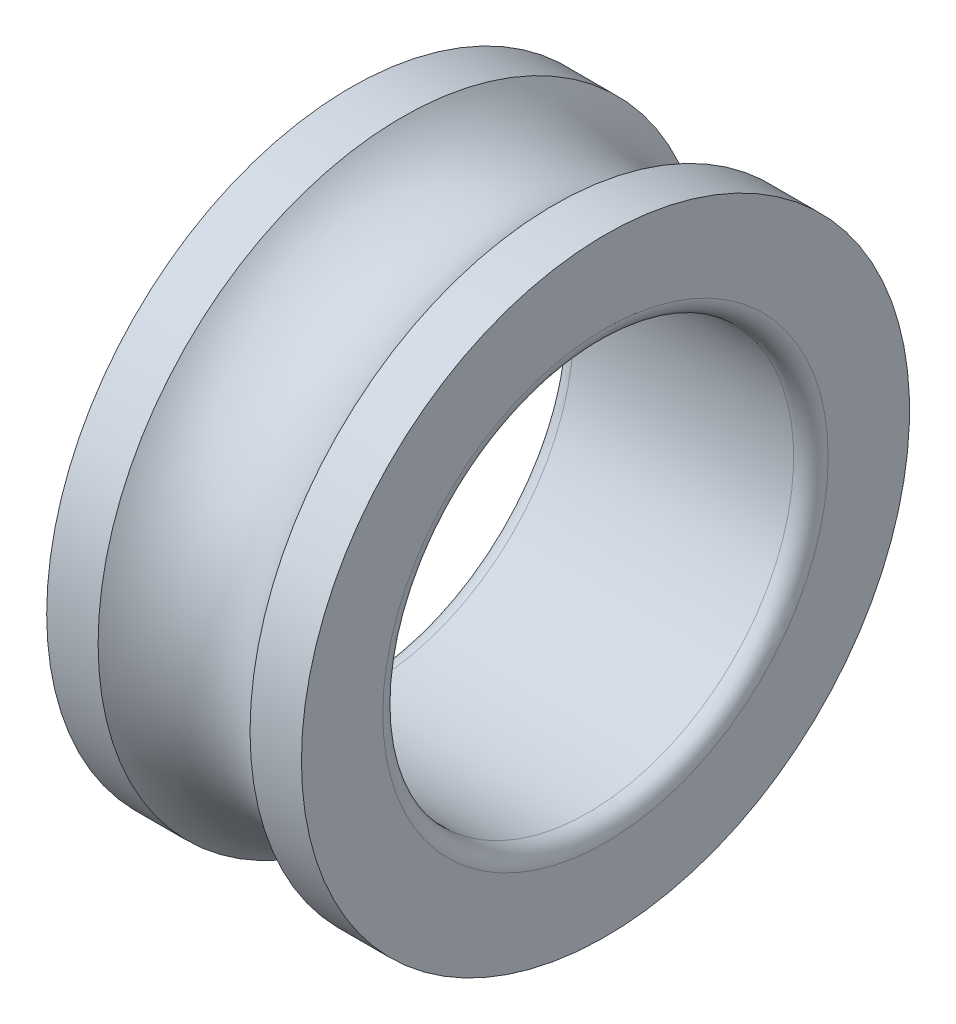
ISO-10303-21;
HEADER;
FILE_DESCRIPTION(('STEP AP214'),'2;1');
FILE_NAME('part.step','',(''),(''),'','','');
FILE_SCHEMA(('AUTOMOTIVE_DESIGN { 1 0 10303 214 1 1 1 1 }'));
ENDSEC;
DATA;
#1=APPLICATION_CONTEXT('core data for automotive mechanical design processes');
#2=APPLICATION_PROTOCOL_DEFINITION('international standard','automotive_design',2000,#1);
#3=PRODUCT_CONTEXT('',#1,'mechanical');
#4=PRODUCT('Part','Part','',(#3));
#5=PRODUCT_RELATED_PRODUCT_CATEGORY('part','',(#4));
#6=PRODUCT_DEFINITION_FORMATION('','',#4);
#7=PRODUCT_DEFINITION_CONTEXT('part definition',#1,'design');
#8=PRODUCT_DEFINITION('design','',#6,#7);
#9=PRODUCT_DEFINITION_SHAPE('','',#8);
#10=(LENGTH_UNIT() NAMED_UNIT(*) SI_UNIT(.MILLI.,.METRE.));
#11=(NAMED_UNIT(*) PLANE_ANGLE_UNIT() SI_UNIT($,.RADIAN.));
#12=(NAMED_UNIT(*) SI_UNIT($,.STERADIAN.) SOLID_ANGLE_UNIT());
#13=UNCERTAINTY_MEASURE_WITH_UNIT(LENGTH_MEASURE(1.E-05),#10,'distance_accuracy_value','');
#14=(GEOMETRIC_REPRESENTATION_CONTEXT(3) GLOBAL_UNCERTAINTY_ASSIGNED_CONTEXT((#13)) GLOBAL_UNIT_ASSIGNED_CONTEXT((#10,
#11,#12)) REPRESENTATION_CONTEXT('',''));
#15=CARTESIAN_POINT('',(0.,0.,0.));
#16=DIRECTION('',(0.,0.,1.));
#17=DIRECTION('',(1.,0.,0.));
#18=AXIS2_PLACEMENT_3D('',#15,#16,#17);
#19=CARTESIAN_POINT('',(-15.5,37.,0.));
#20=DIRECTION('',(1.,0.,0.));
#21=DIRECTION('',(0.,0.,-1.));
#22=AXIS2_PLACEMENT_3D('',#19,#20,#21);
#23=PLANE('',#22);
#24=CARTESIAN_POINT('',(-15.5,0.,0.));
#25=DIRECTION('',(-1.,0.,0.));
#26=DIRECTION('',(0.,0.,1.));
#27=AXIS2_PLACEMENT_3D('',#24,#25,#26);
#28=CIRCLE('',#27,27.1);
#29=CARTESIAN_POINT('',(-15.5,0.,27.1));
#30=VERTEX_POINT('',#29);
#31=EDGE_CURVE('E10',#30,#30,#28,.T.);
#32=ORIENTED_EDGE('',*,*,#31,.F.);
#33=EDGE_LOOP('',(#32));
#34=FACE_BOUND('',#33,.T.);
#35=CARTESIAN_POINT('',(-15.5,0.,0.));
#36=DIRECTION('',(-1.,0.,0.));
#37=DIRECTION('',(0.,0.,1.));
#38=AXIS2_PLACEMENT_3D('',#35,#36,#37);
#39=CIRCLE('',#38,37.);
#40=CARTESIAN_POINT('',(-15.5,0.,37.));
#41=VERTEX_POINT('',#40);
#42=EDGE_CURVE('E64',#41,#41,#39,.T.);
#43=ORIENTED_EDGE('',*,*,#42,.T.);
#44=EDGE_LOOP('',(#43));
#45=FACE_BOUND('',#44,.T.);
#46=ADVANCED_FACE('F36',(#34,#45),#23,.F.);
#47=CARTESIAN_POINT('',(-13.4,0.,0.));
#48=DIRECTION('',(-1.,0.,0.));
#49=DIRECTION('',(0.,0.,1.));
#50=AXIS2_PLACEMENT_3D('',#47,#48,#49);
#51=TOROIDAL_SURFACE('',#50,27.1,2.1);
#52=CARTESIAN_POINT('',(-13.4,0.,0.));
#53=DIRECTION('',(-1.,0.,0.));
#54=DIRECTION('',(0.,0.,1.));
#55=AXIS2_PLACEMENT_3D('',#52,#53,#54);
#56=CIRCLE('',#55,25.);
#57=CARTESIAN_POINT('',(-13.4,0.,25.));
#58=VERTEX_POINT('',#57);
#59=EDGE_CURVE('E42',#58,#58,#56,.T.);
#60=ORIENTED_EDGE('',*,*,#59,.F.);
#61=EDGE_LOOP('',(#60));
#62=FACE_BOUND('',#61,.T.);
#63=ORIENTED_EDGE('',*,*,#31,.T.);
#64=EDGE_LOOP('',(#63));
#65=FACE_BOUND('',#64,.T.);
#66=ADVANCED_FACE('F101',(#62,#65),#51,.T.);
#67=CARTESIAN_POINT('',(-24.761443411834,0.,0.));
#68=DIRECTION('',(-1.,0.,0.));
#69=DIRECTION('',(0.,0.,1.));
#70=AXIS2_PLACEMENT_3D('',#67,#68,#69);
#71=CYLINDRICAL_SURFACE('',#70,25.);
#72=CARTESIAN_POINT('',(13.4,0.,0.));
#73=DIRECTION('',(-1.,0.,0.));
#74=DIRECTION('',(0.,0.,1.));
#75=AXIS2_PLACEMENT_3D('',#72,#73,#74);
#76=CIRCLE('',#75,25.);
#77=CARTESIAN_POINT('',(13.4,0.,25.));
#78=VERTEX_POINT('',#77);
#79=EDGE_CURVE('E46',#78,#78,#76,.T.);
#80=ORIENTED_EDGE('',*,*,#79,.F.);
#81=EDGE_LOOP('',(#80));
#82=FACE_BOUND('',#81,.T.);
#83=ORIENTED_EDGE('',*,*,#59,.T.);
#84=EDGE_LOOP('',(#83));
#85=FACE_BOUND('',#84,.T.);
#86=ADVANCED_FACE('F96',(#82,#85),#71,.F.);
#87=CARTESIAN_POINT('',(13.4,0.,0.));
#88=DIRECTION('',(-1.,0.,0.));
#89=DIRECTION('',(0.,0.,1.));
#90=AXIS2_PLACEMENT_3D('',#87,#88,#89);
#91=TOROIDAL_SURFACE('',#90,27.1,2.1);
#92=CARTESIAN_POINT('',(15.5,0.,0.));
#93=DIRECTION('',(-1.,0.,0.));
#94=DIRECTION('',(0.,0.,1.));
#95=AXIS2_PLACEMENT_3D('',#92,#93,#94);
#96=CIRCLE('',#95,27.1);
#97=CARTESIAN_POINT('',(15.5,0.,27.1));
#98=VERTEX_POINT('',#97);
#99=EDGE_CURVE('E50',#98,#98,#96,.T.);
#100=ORIENTED_EDGE('',*,*,#99,.F.);
#101=EDGE_LOOP('',(#100));
#102=FACE_BOUND('',#101,.T.);
#103=ORIENTED_EDGE('',*,*,#79,.T.);
#104=EDGE_LOOP('',(#103));
#105=FACE_BOUND('',#104,.T.);
#106=ADVANCED_FACE('F90',(#102,#105),#91,.T.);
#107=CARTESIAN_POINT('',(15.5,37.,0.));
#108=DIRECTION('',(-1.,0.,0.));
#109=DIRECTION('',(0.,0.,1.));
#110=AXIS2_PLACEMENT_3D('',#107,#108,#109);
#111=PLANE('',#110);
#112=CARTESIAN_POINT('',(15.5,0.,0.));
#113=DIRECTION('',(-1.,0.,0.));
#114=DIRECTION('',(0.,0.,1.));
#115=AXIS2_PLACEMENT_3D('',#112,#113,#114);
#116=CIRCLE('',#115,37.);
#117=CARTESIAN_POINT('',(15.5,0.,37.));
#118=VERTEX_POINT('',#117);
#119=EDGE_CURVE('E55',#118,#118,#116,.T.);
#120=ORIENTED_EDGE('',*,*,#119,.F.);
#121=EDGE_LOOP('',(#120));
#122=FACE_BOUND('',#121,.T.);
#123=ORIENTED_EDGE('',*,*,#99,.T.);
#124=EDGE_LOOP('',(#123));
#125=FACE_BOUND('',#124,.T.);
#126=ADVANCED_FACE('F84',(#122,#125),#111,.F.);
#127=CARTESIAN_POINT('',(-24.761443411834,0.,0.));
#128=DIRECTION('',(-1.,0.,0.));
#129=DIRECTION('',(0.,0.,1.));
#130=AXIS2_PLACEMENT_3D('',#127,#128,#129);
#131=CYLINDRICAL_SURFACE('',#130,37.);
#132=CARTESIAN_POINT('',(9.24426332027484,0.,0.));
#133=DIRECTION('',(-1.,0.,0.));
#134=DIRECTION('',(0.,0.,1.));
#135=AXIS2_PLACEMENT_3D('',#132,#133,#134);
#136=CIRCLE('',#135,37.);
#137=CARTESIAN_POINT('',(9.24426332027484,0.,37.));
#138=VERTEX_POINT('',#137);
#139=EDGE_CURVE('E58',#138,#138,#136,.T.);
#140=ORIENTED_EDGE('',*,*,#139,.F.);
#141=EDGE_LOOP('',(#140));
#142=FACE_BOUND('',#141,.T.);
#143=ORIENTED_EDGE('',*,*,#119,.T.);
#144=EDGE_LOOP('',(#143));
#145=FACE_BOUND('',#144,.T.);
#146=ADVANCED_FACE('F78',(#142,#145),#131,.T.);
#147=CARTESIAN_POINT('',(0.,0.,0.));
#148=DIRECTION('',(-1.,0.,0.));
#149=DIRECTION('',(0.,0.,1.));
#150=AXIS2_PLACEMENT_3D('',#147,#148,#149);
#151=TOROIDAL_SURFACE('',#150,44.6513786774294,12.);
#152=CARTESIAN_POINT('',(-9.24426332027484,0.,0.));
#153=DIRECTION('',(-1.,0.,0.));
#154=DIRECTION('',(0.,0.,1.));
#155=AXIS2_PLACEMENT_3D('',#152,#153,#154);
#156=CIRCLE('',#155,37.);
#157=CARTESIAN_POINT('',(-9.24426332027484,0.,37.));
#158=VERTEX_POINT('',#157);
#159=EDGE_CURVE('E61',#158,#158,#156,.T.);
#160=ORIENTED_EDGE('',*,*,#159,.F.);
#161=EDGE_LOOP('',(#160));
#162=FACE_BOUND('',#161,.T.);
#163=ORIENTED_EDGE('',*,*,#139,.T.);
#164=EDGE_LOOP('',(#163));
#165=FACE_BOUND('',#164,.T.);
#166=ADVANCED_FACE('F72',(#162,#165),#151,.F.);
#167=CARTESIAN_POINT('',(-24.761443411834,0.,0.));
#168=DIRECTION('',(-1.,0.,0.));
#169=DIRECTION('',(0.,0.,1.));
#170=AXIS2_PLACEMENT_3D('',#167,#168,#169);
#171=CYLINDRICAL_SURFACE('',#170,37.);
#172=ORIENTED_EDGE('',*,*,#42,.F.);
#173=EDGE_LOOP('',(#172));
#174=FACE_BOUND('',#173,.T.);
#175=ORIENTED_EDGE('',*,*,#159,.T.);
#176=EDGE_LOOP('',(#175));
#177=FACE_BOUND('',#176,.T.);
#178=ADVANCED_FACE('F69',(#174,#177),#171,.T.);
#179=CLOSED_SHELL('',(#46,#66,#86,#106,#126,#146,#166,#178));
#180=MANIFOLD_SOLID_BREP('B2',#179);
#181=ADVANCED_BREP_SHAPE_REPRESENTATION('',(#18,#180),#14);
#182=SHAPE_DEFINITION_REPRESENTATION(#9,#181);
ENDSEC;
END-ISO-10303-21;
